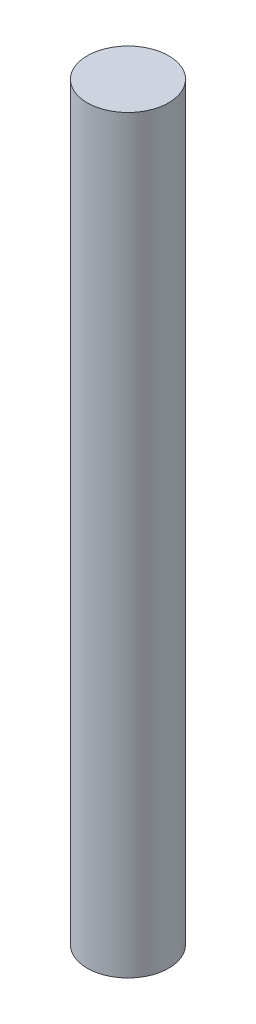
ISO-10303-21;
HEADER;
FILE_DESCRIPTION(('STEP AP214'),'2;1');
FILE_NAME('part.step','',(''),(''),'','','');
FILE_SCHEMA(('AUTOMOTIVE_DESIGN { 1 0 10303 214 1 1 1 1 }'));
ENDSEC;
DATA;
#1=APPLICATION_CONTEXT('core data for automotive mechanical design processes');
#2=APPLICATION_PROTOCOL_DEFINITION('international standard','automotive_design',2000,#1);
#3=PRODUCT_CONTEXT('',#1,'mechanical');
#4=PRODUCT('Part','Part','',(#3));
#5=PRODUCT_RELATED_PRODUCT_CATEGORY('part','',(#4));
#6=PRODUCT_DEFINITION_FORMATION('','',#4);
#7=PRODUCT_DEFINITION_CONTEXT('part definition',#1,'design');
#8=PRODUCT_DEFINITION('design','',#6,#7);
#9=PRODUCT_DEFINITION_SHAPE('','',#8);
#10=(LENGTH_UNIT() NAMED_UNIT(*) SI_UNIT(.MILLI.,.METRE.));
#11=(NAMED_UNIT(*) PLANE_ANGLE_UNIT() SI_UNIT($,.RADIAN.));
#12=(NAMED_UNIT(*) SI_UNIT($,.STERADIAN.) SOLID_ANGLE_UNIT());
#13=UNCERTAINTY_MEASURE_WITH_UNIT(LENGTH_MEASURE(1.E-05),#10,'distance_accuracy_value','');
#14=(GEOMETRIC_REPRESENTATION_CONTEXT(3) GLOBAL_UNCERTAINTY_ASSIGNED_CONTEXT((#13)) GLOBAL_UNIT_ASSIGNED_CONTEXT((#10,
#11,#12)) REPRESENTATION_CONTEXT('',''));
#15=CARTESIAN_POINT('',(0.,0.,0.));
#16=DIRECTION('',(0.,0.,1.));
#17=DIRECTION('',(1.,0.,0.));
#18=AXIS2_PLACEMENT_3D('',#15,#16,#17);
#19=CARTESIAN_POINT('',(0.,9.2,0.));
#20=DIRECTION('',(0.,-1.,0.));
#21=DIRECTION('',(0.,0.,-1.));
#22=AXIS2_PLACEMENT_3D('',#19,#20,#21);
#23=CYLINDRICAL_SURFACE('',#22,0.5);
#24=CARTESIAN_POINT('',(0.,9.2,0.));
#25=DIRECTION('',(0.,1.,0.));
#26=DIRECTION('',(0.,0.,1.));
#27=AXIS2_PLACEMENT_3D('',#24,#25,#26);
#28=CIRCLE('',#27,0.5);
#29=CARTESIAN_POINT('',(0.,9.2,0.5));
#30=VERTEX_POINT('',#29);
#31=EDGE_CURVE('E10',#30,#30,#28,.T.);
#32=ORIENTED_EDGE('',*,*,#31,.F.);
#33=EDGE_LOOP('',(#32));
#34=FACE_BOUND('',#33,.T.);
#35=CARTESIAN_POINT('',(0.,0.,0.));
#36=DIRECTION('',(0.,1.,0.));
#37=DIRECTION('',(0.,0.,1.));
#38=AXIS2_PLACEMENT_3D('',#35,#36,#37);
#39=CIRCLE('',#38,0.5);
#40=CARTESIAN_POINT('',(0.,0.,0.5));
#41=VERTEX_POINT('',#40);
#42=EDGE_CURVE('E36',#41,#41,#39,.T.);
#43=ORIENTED_EDGE('',*,*,#42,.T.);
#44=EDGE_LOOP('',(#43));
#45=FACE_BOUND('',#44,.T.);
#46=ADVANCED_FACE('F33',(#34,#45),#23,.T.);
#47=CARTESIAN_POINT('',(0.,9.2,0.));
#48=DIRECTION('',(0.,1.,0.));
#49=DIRECTION('',(0.,0.,1.));
#50=AXIS2_PLACEMENT_3D('',#47,#48,#49);
#51=PLANE('',#50);
#52=ORIENTED_EDGE('',*,*,#31,.T.);
#53=EDGE_LOOP('',(#52));
#54=FACE_BOUND('',#53,.T.);
#55=ADVANCED_FACE('F48',(#54),#51,.T.);
#56=CARTESIAN_POINT('',(0.,0.,0.));
#57=DIRECTION('',(0.,1.,0.));
#58=DIRECTION('',(0.,0.,1.));
#59=AXIS2_PLACEMENT_3D('',#56,#57,#58);
#60=PLANE('',#59);
#61=ORIENTED_EDGE('',*,*,#42,.F.);
#62=EDGE_LOOP('',(#61));
#63=FACE_BOUND('',#62,.T.);
#64=ADVANCED_FACE('F46',(#63),#60,.F.);
#65=CLOSED_SHELL('',(#46,#55,#64));
#66=MANIFOLD_SOLID_BREP('B2',#65);
#67=ADVANCED_BREP_SHAPE_REPRESENTATION('',(#18,#66),#14);
#68=SHAPE_DEFINITION_REPRESENTATION(#9,#67);
ENDSEC;
END-ISO-10303-21;
